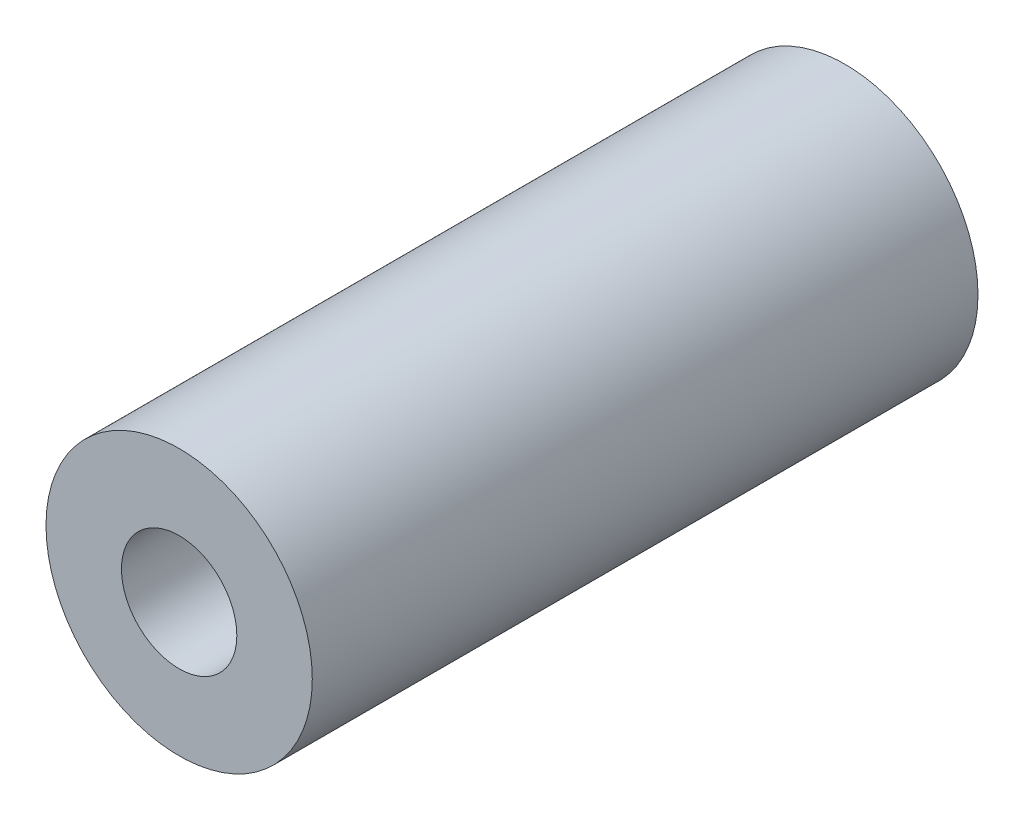
ISO-10303-21;
HEADER;
FILE_DESCRIPTION(('STEP AP214'),'2;1');
FILE_NAME('part.step','',(''),(''),'','','');
FILE_SCHEMA(('AUTOMOTIVE_DESIGN { 1 0 10303 214 1 1 1 1 }'));
ENDSEC;
DATA;
#1=APPLICATION_CONTEXT('core data for automotive mechanical design processes');
#2=APPLICATION_PROTOCOL_DEFINITION('international standard','automotive_design',2000,#1);
#3=PRODUCT_CONTEXT('',#1,'mechanical');
#4=PRODUCT('Part','Part','',(#3));
#5=PRODUCT_RELATED_PRODUCT_CATEGORY('part','',(#4));
#6=PRODUCT_DEFINITION_FORMATION('','',#4);
#7=PRODUCT_DEFINITION_CONTEXT('part definition',#1,'design');
#8=PRODUCT_DEFINITION('design','',#6,#7);
#9=PRODUCT_DEFINITION_SHAPE('','',#8);
#10=(LENGTH_UNIT() NAMED_UNIT(*) SI_UNIT(.MILLI.,.METRE.));
#11=(NAMED_UNIT(*) PLANE_ANGLE_UNIT() SI_UNIT($,.RADIAN.));
#12=(NAMED_UNIT(*) SI_UNIT($,.STERADIAN.) SOLID_ANGLE_UNIT());
#13=UNCERTAINTY_MEASURE_WITH_UNIT(LENGTH_MEASURE(1.E-05),#10,'distance_accuracy_value','');
#14=(GEOMETRIC_REPRESENTATION_CONTEXT(3) GLOBAL_UNCERTAINTY_ASSIGNED_CONTEXT((#13)) GLOBAL_UNIT_ASSIGNED_CONTEXT((#10,
#11,#12)) REPRESENTATION_CONTEXT('',''));
#15=CARTESIAN_POINT('',(0.,0.,0.));
#16=DIRECTION('',(0.,0.,1.));
#17=DIRECTION('',(1.,0.,0.));
#18=AXIS2_PLACEMENT_3D('',#15,#16,#17);
#19=CARTESIAN_POINT('',(0.,0.,15.));
#20=DIRECTION('',(0.,0.,1.));
#21=DIRECTION('',(1.,0.,0.));
#22=AXIS2_PLACEMENT_3D('',#19,#20,#21);
#23=PLANE('',#22);
#24=CARTESIAN_POINT('',(0.,0.,15.));
#25=DIRECTION('',(0.,0.,1.));
#26=DIRECTION('',(1.,0.,0.));
#27=AXIS2_PLACEMENT_3D('',#24,#25,#26);
#28=CIRCLE('',#27,3.);
#29=CARTESIAN_POINT('',(3.,0.,15.));
#30=VERTEX_POINT('',#29);
#31=EDGE_CURVE('E10',#30,#30,#28,.T.);
#32=ORIENTED_EDGE('',*,*,#31,.T.);
#33=EDGE_LOOP('',(#32));
#34=FACE_BOUND('',#33,.T.);
#35=CARTESIAN_POINT('',(0.,0.,15.));
#36=DIRECTION('',(0.,0.,1.));
#37=DIRECTION('',(1.,0.,0.));
#38=AXIS2_PLACEMENT_3D('',#35,#36,#37);
#39=CIRCLE('',#38,1.3);
#40=CARTESIAN_POINT('',(1.3,0.,15.));
#41=VERTEX_POINT('',#40);
#42=EDGE_CURVE('E46',#41,#41,#39,.T.);
#43=ORIENTED_EDGE('',*,*,#42,.F.);
#44=EDGE_LOOP('',(#43));
#45=FACE_BOUND('',#44,.T.);
#46=ADVANCED_FACE('F35',(#34,#45),#23,.T.);
#47=CARTESIAN_POINT('',(0.,0.,0.));
#48=DIRECTION('',(0.,0.,1.));
#49=DIRECTION('',(1.,0.,0.));
#50=AXIS2_PLACEMENT_3D('',#47,#48,#49);
#51=PLANE('',#50);
#52=CARTESIAN_POINT('',(0.,0.,0.));
#53=DIRECTION('',(0.,0.,1.));
#54=DIRECTION('',(1.,0.,0.));
#55=AXIS2_PLACEMENT_3D('',#52,#53,#54);
#56=CIRCLE('',#55,3.);
#57=CARTESIAN_POINT('',(3.,0.,0.));
#58=VERTEX_POINT('',#57);
#59=EDGE_CURVE('E39',#58,#58,#56,.T.);
#60=ORIENTED_EDGE('',*,*,#59,.F.);
#61=EDGE_LOOP('',(#60));
#62=FACE_BOUND('',#61,.T.);
#63=CARTESIAN_POINT('',(0.,0.,0.));
#64=DIRECTION('',(0.,0.,1.));
#65=DIRECTION('',(1.,0.,0.));
#66=AXIS2_PLACEMENT_3D('',#63,#64,#65);
#67=CIRCLE('',#66,1.3);
#68=CARTESIAN_POINT('',(1.3,0.,0.));
#69=VERTEX_POINT('',#68);
#70=EDGE_CURVE('E48',#69,#69,#67,.T.);
#71=ORIENTED_EDGE('',*,*,#70,.T.);
#72=EDGE_LOOP('',(#71));
#73=FACE_BOUND('',#72,.T.);
#74=ADVANCED_FACE('F58',(#62,#73),#51,.F.);
#75=CARTESIAN_POINT('',(0.,0.,15.));
#76=DIRECTION('',(0.,0.,-1.));
#77=DIRECTION('',(-1.,0.,0.));
#78=AXIS2_PLACEMENT_3D('',#75,#76,#77);
#79=CYLINDRICAL_SURFACE('',#78,3.);
#80=ORIENTED_EDGE('',*,*,#31,.F.);
#81=EDGE_LOOP('',(#80));
#82=FACE_BOUND('',#81,.T.);
#83=ORIENTED_EDGE('',*,*,#59,.T.);
#84=EDGE_LOOP('',(#83));
#85=FACE_BOUND('',#84,.T.);
#86=ADVANCED_FACE('F37',(#82,#85),#79,.T.);
#87=CARTESIAN_POINT('',(0.,0.,15.));
#88=DIRECTION('',(0.,0.,-1.));
#89=DIRECTION('',(-1.,0.,0.));
#90=AXIS2_PLACEMENT_3D('',#87,#88,#89);
#91=CYLINDRICAL_SURFACE('',#90,1.3);
#92=ORIENTED_EDGE('',*,*,#42,.T.);
#93=EDGE_LOOP('',(#92));
#94=FACE_BOUND('',#93,.T.);
#95=ORIENTED_EDGE('',*,*,#70,.F.);
#96=EDGE_LOOP('',(#95));
#97=FACE_BOUND('',#96,.T.);
#98=ADVANCED_FACE('F54',(#94,#97),#91,.F.);
#99=CLOSED_SHELL('',(#46,#74,#86,#98));
#100=MANIFOLD_SOLID_BREP('B2',#99);
#101=ADVANCED_BREP_SHAPE_REPRESENTATION('',(#18,#100),#14);
#102=SHAPE_DEFINITION_REPRESENTATION(#9,#101);
ENDSEC;
END-ISO-10303-21;
